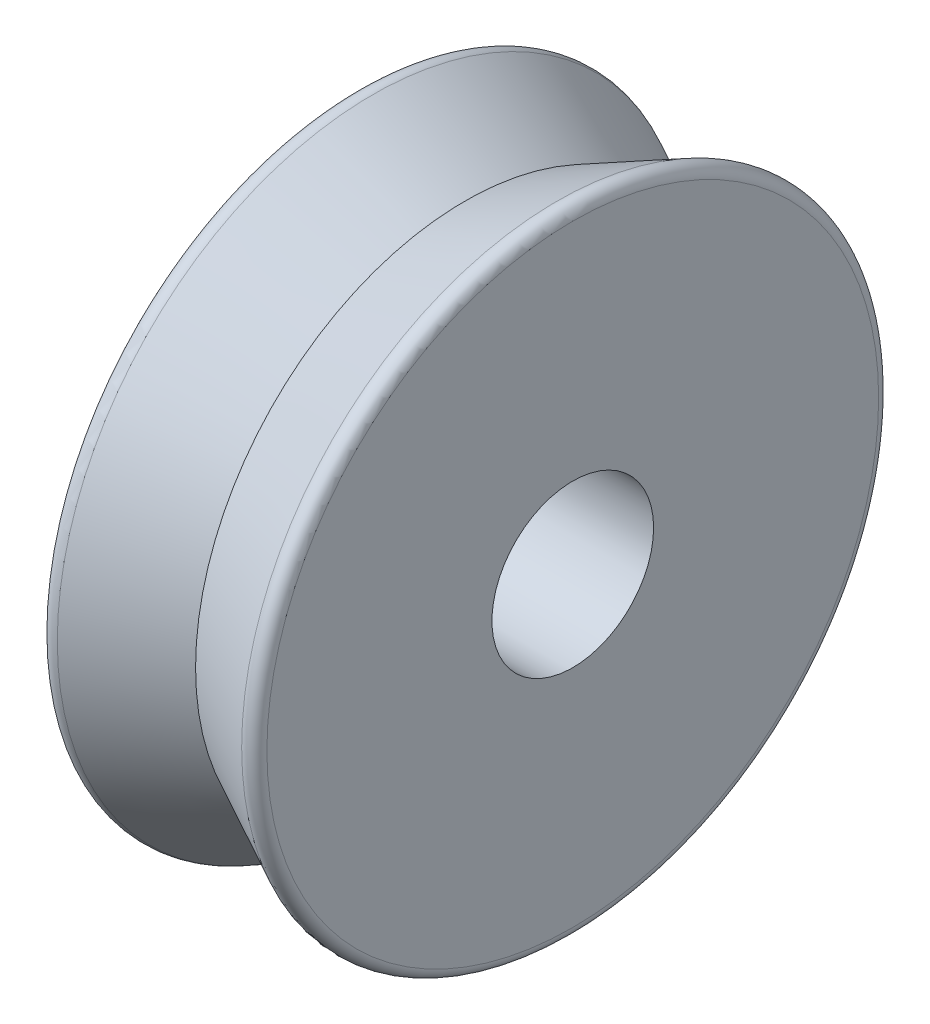
ISO-10303-21;
HEADER;
FILE_DESCRIPTION(('STEP AP214'),'2;1');
FILE_NAME('part.step','',(''),(''),'','','');
FILE_SCHEMA(('AUTOMOTIVE_DESIGN { 1 0 10303 214 1 1 1 1 }'));
ENDSEC;
DATA;
#1=APPLICATION_CONTEXT('core data for automotive mechanical design processes');
#2=APPLICATION_PROTOCOL_DEFINITION('international standard','automotive_design',2000,#1);
#3=PRODUCT_CONTEXT('',#1,'mechanical');
#4=PRODUCT('Part','Part','',(#3));
#5=PRODUCT_RELATED_PRODUCT_CATEGORY('part','',(#4));
#6=PRODUCT_DEFINITION_FORMATION('','',#4);
#7=PRODUCT_DEFINITION_CONTEXT('part definition',#1,'design');
#8=PRODUCT_DEFINITION('design','',#6,#7);
#9=PRODUCT_DEFINITION_SHAPE('','',#8);
#10=(LENGTH_UNIT() NAMED_UNIT(*) SI_UNIT(.MILLI.,.METRE.));
#11=(NAMED_UNIT(*) PLANE_ANGLE_UNIT() SI_UNIT($,.RADIAN.));
#12=(NAMED_UNIT(*) SI_UNIT($,.STERADIAN.) SOLID_ANGLE_UNIT());
#13=UNCERTAINTY_MEASURE_WITH_UNIT(LENGTH_MEASURE(1.E-05),#10,'distance_accuracy_value','');
#14=(GEOMETRIC_REPRESENTATION_CONTEXT(3) GLOBAL_UNCERTAINTY_ASSIGNED_CONTEXT((#13)) GLOBAL_UNIT_ASSIGNED_CONTEXT((#10,
#11,#12)) REPRESENTATION_CONTEXT('',''));
#15=CARTESIAN_POINT('',(0.,0.,0.));
#16=DIRECTION('',(0.,0.,1.));
#17=DIRECTION('',(1.,0.,0.));
#18=AXIS2_PLACEMENT_3D('',#15,#16,#17);
#19=CARTESIAN_POINT('',(2.,0.,0.));
#20=DIRECTION('',(1.,0.,0.));
#21=DIRECTION('',(0.,0.,-1.));
#22=AXIS2_PLACEMENT_3D('',#19,#20,#21);
#23=CONICAL_SURFACE('',#22,6.,0.463647609000806);
#24=CARTESIAN_POINT('',(1.71055728090001,0.,0.));
#25=DIRECTION('',(-1.,0.,0.));
#26=DIRECTION('',(0.,0.,1.));
#27=AXIS2_PLACEMENT_3D('',#24,#25,#26);
#28=CIRCLE('',#27,5.85527864045001);
#29=CARTESIAN_POINT('',(1.71055728090001,0.,5.85527864045001));
#30=VERTEX_POINT('',#29);
#31=EDGE_CURVE('E49',#30,#30,#28,.T.);
#32=ORIENTED_EDGE('',*,*,#31,.T.);
#33=EDGE_LOOP('',(#32));
#34=FACE_BOUND('',#33,.T.);
#35=CARTESIAN_POINT('',(0.,0.,0.));
#36=DIRECTION('',(-1.,0.,0.));
#37=DIRECTION('',(0.,0.,1.));
#38=AXIS2_PLACEMENT_3D('',#35,#36,#37);
#39=CIRCLE('',#38,5.);
#40=CARTESIAN_POINT('',(0.,0.,5.));
#41=VERTEX_POINT('',#40);
#42=EDGE_CURVE('E54',#41,#41,#39,.T.);
#43=ORIENTED_EDGE('',*,*,#42,.F.);
#44=EDGE_LOOP('',(#43));
#45=FACE_BOUND('',#44,.T.);
#46=ADVANCED_FACE('F34',(#34,#45),#23,.T.);
#47=CARTESIAN_POINT('',(2.,6.,0.));
#48=DIRECTION('',(-1.,0.,0.));
#49=DIRECTION('',(0.,0.,1.));
#50=AXIS2_PLACEMENT_3D('',#47,#48,#49);
#51=PLANE('',#50);
#52=CARTESIAN_POINT('',(2.,0.,0.));
#53=DIRECTION('',(-1.,0.,0.));
#54=DIRECTION('',(0.,0.,1.));
#55=AXIS2_PLACEMENT_3D('',#52,#53,#54);
#56=CIRCLE('',#55,5.67639320225002);
#57=CARTESIAN_POINT('',(2.,0.,5.67639320225002));
#58=VERTEX_POINT('',#57);
#59=EDGE_CURVE('E45',#58,#58,#56,.F.);
#60=ORIENTED_EDGE('',*,*,#59,.T.);
#61=EDGE_LOOP('',(#60));
#62=FACE_BOUND('',#61,.T.);
#63=CARTESIAN_POINT('',(2.,0.,0.));
#64=DIRECTION('',(1.,0.,0.));
#65=DIRECTION('',(0.,0.,-1.));
#66=AXIS2_PLACEMENT_3D('',#63,#64,#65);
#67=CIRCLE('',#66,1.5);
#68=CARTESIAN_POINT('',(2.,0.,-1.5));
#69=VERTEX_POINT('',#68);
#70=EDGE_CURVE('E60',#69,#69,#67,.T.);
#71=ORIENTED_EDGE('',*,*,#70,.F.);
#72=EDGE_LOOP('',(#71));
#73=FACE_BOUND('',#72,.T.);
#74=ADVANCED_FACE('F66',(#62,#73),#51,.F.);
#75=CARTESIAN_POINT('',(-2.,6.,0.));
#76=DIRECTION('',(1.,0.,0.));
#77=DIRECTION('',(0.,0.,-1.));
#78=AXIS2_PLACEMENT_3D('',#75,#76,#77);
#79=PLANE('',#78);
#80=CARTESIAN_POINT('',(-2.,0.,0.));
#81=DIRECTION('',(1.,0.,0.));
#82=DIRECTION('',(0.,0.,-1.));
#83=AXIS2_PLACEMENT_3D('',#80,#81,#82);
#84=CIRCLE('',#83,5.67639320225002);
#85=CARTESIAN_POINT('',(-2.,0.,-5.67639320225002));
#86=VERTEX_POINT('',#85);
#87=EDGE_CURVE('E41',#86,#86,#84,.F.);
#88=ORIENTED_EDGE('',*,*,#87,.T.);
#89=EDGE_LOOP('',(#88));
#90=FACE_BOUND('',#89,.T.);
#91=CARTESIAN_POINT('',(-2.,0.,0.));
#92=DIRECTION('',(1.,0.,0.));
#93=DIRECTION('',(0.,0.,-1.));
#94=AXIS2_PLACEMENT_3D('',#91,#92,#93);
#95=CIRCLE('',#94,1.5);
#96=CARTESIAN_POINT('',(-2.,0.,-1.5));
#97=VERTEX_POINT('',#96);
#98=EDGE_CURVE('E57',#97,#97,#95,.T.);
#99=ORIENTED_EDGE('',*,*,#98,.T.);
#100=EDGE_LOOP('',(#99));
#101=FACE_BOUND('',#100,.T.);
#102=ADVANCED_FACE('F68',(#90,#101),#79,.F.);
#103=CARTESIAN_POINT('',(0.,0.,0.));
#104=DIRECTION('',(-1.,0.,0.));
#105=DIRECTION('',(0.,0.,1.));
#106=AXIS2_PLACEMENT_3D('',#103,#104,#105);
#107=CONICAL_SURFACE('',#106,5.,0.463647609000806);
#108=CARTESIAN_POINT('',(-1.71055728090001,0.,0.));
#109=DIRECTION('',(1.,0.,0.));
#110=DIRECTION('',(0.,0.,-1.));
#111=AXIS2_PLACEMENT_3D('',#108,#109,#110);
#112=CIRCLE('',#111,5.85527864045001);
#113=CARTESIAN_POINT('',(-1.71055728090001,0.,-5.85527864045001));
#114=VERTEX_POINT('',#113);
#115=EDGE_CURVE('E10',#114,#114,#112,.T.);
#116=ORIENTED_EDGE('',*,*,#115,.T.);
#117=EDGE_LOOP('',(#116));
#118=FACE_BOUND('',#117,.T.);
#119=ORIENTED_EDGE('',*,*,#42,.T.);
#120=EDGE_LOOP('',(#119));
#121=FACE_BOUND('',#120,.T.);
#122=ADVANCED_FACE('F75',(#118,#121),#107,.T.);
#123=CARTESIAN_POINT('',(-2.,0.,0.));
#124=DIRECTION('',(1.,0.,0.));
#125=DIRECTION('',(0.,0.,-1.));
#126=AXIS2_PLACEMENT_3D('',#123,#124,#125);
#127=CYLINDRICAL_SURFACE('',#126,1.5);
#128=ORIENTED_EDGE('',*,*,#98,.F.);
#129=EDGE_LOOP('',(#128));
#130=FACE_BOUND('',#129,.T.);
#131=ORIENTED_EDGE('',*,*,#70,.T.);
#132=EDGE_LOOP('',(#131));
#133=FACE_BOUND('',#132,.T.);
#134=ADVANCED_FACE('F64',(#130,#133),#127,.F.);
#135=CARTESIAN_POINT('',(1.8,0.,0.));
#136=DIRECTION('',(-1.,0.,0.));
#137=DIRECTION('',(0.,0.,1.));
#138=AXIS2_PLACEMENT_3D('',#135,#136,#137);
#139=TOROIDAL_SURFACE('',#138,5.67639320225002,0.2);
#140=ORIENTED_EDGE('',*,*,#59,.F.);
#141=EDGE_LOOP('',(#140));
#142=FACE_BOUND('',#141,.T.);
#143=ORIENTED_EDGE('',*,*,#31,.F.);
#144=EDGE_LOOP('',(#143));
#145=FACE_BOUND('',#144,.T.);
#146=ADVANCED_FACE('F80',(#142,#145),#139,.T.);
#147=CARTESIAN_POINT('',(-1.8,0.,0.));
#148=DIRECTION('',(1.,0.,0.));
#149=DIRECTION('',(0.,0.,-1.));
#150=AXIS2_PLACEMENT_3D('',#147,#148,#149);
#151=TOROIDAL_SURFACE('',#150,5.67639320225002,0.2);
#152=ORIENTED_EDGE('',*,*,#115,.F.);
#153=EDGE_LOOP('',(#152));
#154=FACE_BOUND('',#153,.T.);
#155=ORIENTED_EDGE('',*,*,#87,.F.);
#156=EDGE_LOOP('',(#155));
#157=FACE_BOUND('',#156,.T.);
#158=ADVANCED_FACE('F36',(#154,#157),#151,.T.);
#159=CLOSED_SHELL('',(#46,#74,#102,#122,#134,#146,#158));
#160=MANIFOLD_SOLID_BREP('B2',#159);
#161=ADVANCED_BREP_SHAPE_REPRESENTATION('',(#18,#160),#14);
#162=SHAPE_DEFINITION_REPRESENTATION(#9,#161);
ENDSEC;
END-ISO-10303-21;
